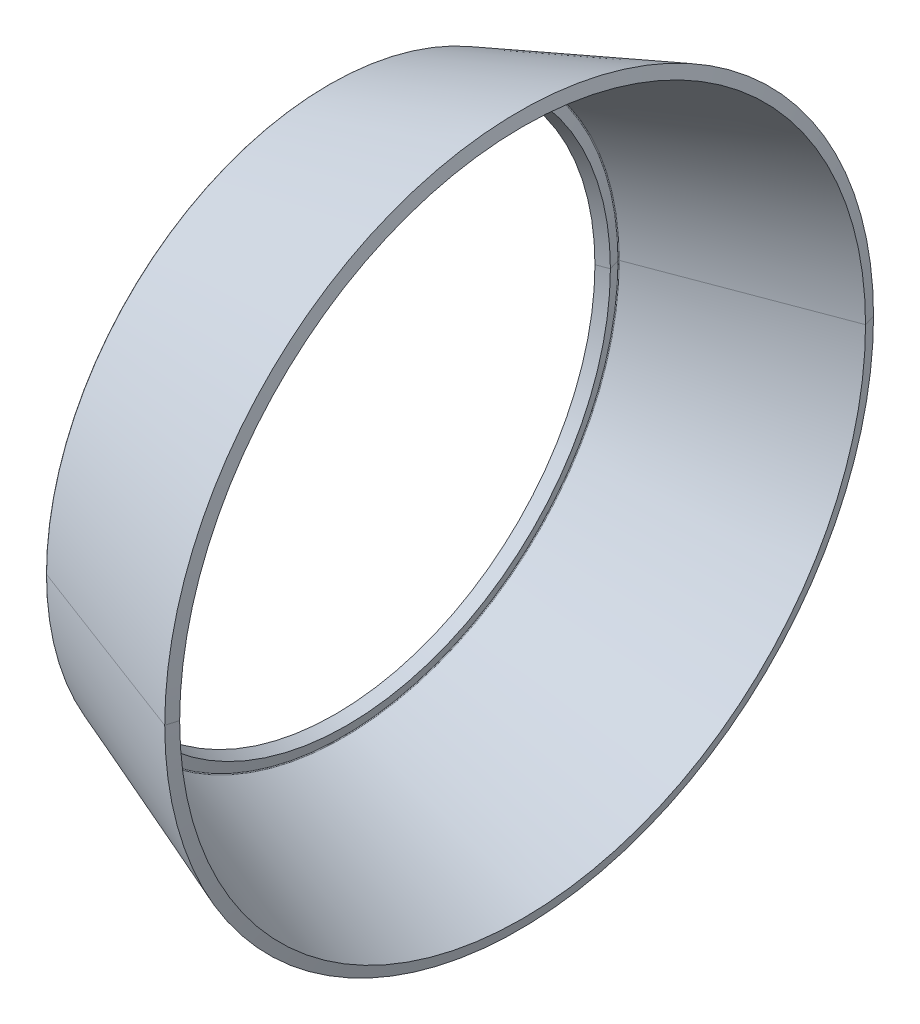
ISO-10303-21;
HEADER;
FILE_DESCRIPTION(('STEP AP214'),'2;1');
FILE_NAME('part.step','',(''),(''),'','','');
FILE_SCHEMA(('AUTOMOTIVE_DESIGN { 1 0 10303 214 1 1 1 1 }'));
ENDSEC;
DATA;
#1=APPLICATION_CONTEXT('core data for automotive mechanical design processes');
#2=APPLICATION_PROTOCOL_DEFINITION('international standard','automotive_design',2000,#1);
#3=PRODUCT_CONTEXT('',#1,'mechanical');
#4=PRODUCT('Part','Part','',(#3));
#5=PRODUCT_RELATED_PRODUCT_CATEGORY('part','',(#4));
#6=PRODUCT_DEFINITION_FORMATION('','',#4);
#7=PRODUCT_DEFINITION_CONTEXT('part definition',#1,'design');
#8=PRODUCT_DEFINITION('design','',#6,#7);
#9=PRODUCT_DEFINITION_SHAPE('','',#8);
#10=(LENGTH_UNIT() NAMED_UNIT(*) SI_UNIT(.MILLI.,.METRE.));
#11=(NAMED_UNIT(*) PLANE_ANGLE_UNIT() SI_UNIT($,.RADIAN.));
#12=(NAMED_UNIT(*) SI_UNIT($,.STERADIAN.) SOLID_ANGLE_UNIT());
#13=UNCERTAINTY_MEASURE_WITH_UNIT(LENGTH_MEASURE(1.E-05),#10,'distance_accuracy_value','');
#14=(GEOMETRIC_REPRESENTATION_CONTEXT(3) GLOBAL_UNCERTAINTY_ASSIGNED_CONTEXT((#13)) GLOBAL_UNIT_ASSIGNED_CONTEXT((#10,
#11,#12)) REPRESENTATION_CONTEXT('',''));
#15=CARTESIAN_POINT('',(0.,0.,0.));
#16=DIRECTION('',(0.,0.,1.));
#17=DIRECTION('',(1.,0.,0.));
#18=AXIS2_PLACEMENT_3D('',#15,#16,#17);
#19=CARTESIAN_POINT('',(14.857621984077,0.,0.));
#20=DIRECTION('',(1.,0.,0.));
#21=DIRECTION('',(0.,1.,0.));
#22=AXIS2_PLACEMENT_3D('',#19,#20,#21);
#23=CONICAL_SURFACE('',#22,29.6324119771,0.3606897432);
#24=CARTESIAN_POINT('',(-0.996642846062906,0.,0.));
#25=DIRECTION('',(1.,0.,0.));
#26=DIRECTION('',(0.,0.,-1.));
#27=AXIS2_PLACEMENT_3D('',#24,#25,#26);
#28=CIRCLE('',#27,23.6523335549);
#29=CARTESIAN_POINT('',(-0.996642846172319,0.,23.6523335551901));
#30=VERTEX_POINT('',#29);
#31=CARTESIAN_POINT('',(-0.996642846062906,0.,-23.652333554949));
#32=VERTEX_POINT('',#31);
#33=EDGE_CURVE('E13',#30,#32,#28,.T.);
#34=ORIENTED_EDGE('',*,*,#33,.T.);
#35=DIRECTION('',(0.935653622315837,0.,-0.352919677897469));
#36=VECTOR('',#35,1.);
#37=CARTESIAN_POINT('',(-0.996642846172319,0.,-23.6523335551901));
#38=LINE('',#37,#36);
#39=CARTESIAN_POINT('',(14.857621984077,0.,-29.632411977128));
#40=VERTEX_POINT('',#39);
#41=EDGE_CURVE('E35',#32,#40,#38,.T.);
#42=ORIENTED_EDGE('',*,*,#41,.T.);
#43=CARTESIAN_POINT('',(14.857621984077,0.,0.));
#44=DIRECTION('',(1.,0.,0.));
#45=DIRECTION('',(0.,0.,-1.));
#46=AXIS2_PLACEMENT_3D('',#43,#44,#45);
#47=CIRCLE('',#46,29.6324119771);
#48=CARTESIAN_POINT('',(14.857621984077,0.,29.6324119771));
#49=VERTEX_POINT('',#48);
#50=EDGE_CURVE('E116',#49,#40,#47,.T.);
#51=ORIENTED_EDGE('',*,*,#50,.F.);
#52=DIRECTION('',(0.935653622315837,0.,0.352919677897469));
#53=VECTOR('',#52,1.);
#54=CARTESIAN_POINT('',(-0.996642846172319,0.,23.6523335551901));
#55=LINE('',#54,#53);
#56=EDGE_CURVE('E323',#30,#49,#55,.T.);
#57=ORIENTED_EDGE('',*,*,#56,.F.);
#58=EDGE_LOOP('',(#34,#42,#51,#57));
#59=FACE_BOUND('',#58,.T.);
#60=ADVANCED_FACE('F27',(#59),#23,.T.);
#61=CARTESIAN_POINT('',(14.857621984077,0.,0.));
#62=DIRECTION('',(1.,0.,0.));
#63=DIRECTION('',(0.,-1.,0.));
#64=AXIS2_PLACEMENT_3D('',#61,#62,#63);
#65=CONICAL_SURFACE('',#64,29.6324119771,0.3606897432);
#66=CARTESIAN_POINT('',(14.857621984077,0.,0.));
#67=DIRECTION('',(1.,0.,0.));
#68=DIRECTION('',(0.,0.,-1.));
#69=AXIS2_PLACEMENT_3D('',#66,#67,#68);
#70=CIRCLE('',#69,29.6324119771);
#71=EDGE_CURVE('E319',#40,#49,#70,.T.);
#72=ORIENTED_EDGE('',*,*,#71,.F.);
#73=ORIENTED_EDGE('',*,*,#41,.F.);
#74=CARTESIAN_POINT('',(-0.996642846062906,0.,0.));
#75=DIRECTION('',(1.,0.,0.));
#76=DIRECTION('',(0.,0.,-1.));
#77=AXIS2_PLACEMENT_3D('',#74,#75,#76);
#78=CIRCLE('',#77,23.6523335549);
#79=EDGE_CURVE('E316',#32,#30,#78,.T.);
#80=ORIENTED_EDGE('',*,*,#79,.T.);
#81=ORIENTED_EDGE('',*,*,#56,.T.);
#82=EDGE_LOOP('',(#72,#73,#80,#81));
#83=FACE_BOUND('',#82,.T.);
#84=ADVANCED_FACE('F336',(#83),#65,.T.);
#85=CARTESIAN_POINT('',(-0.961350878272621,0.,0.));
#86=DIRECTION('',(1.,0.,0.));
#87=DIRECTION('',(0.,-1.,0.));
#88=AXIS2_PLACEMENT_3D('',#85,#86,#87);
#89=TOROIDAL_SURFACE('',#88,23.5587681927,0.1);
#90=ORIENTED_EDGE('',*,*,#79,.F.);
#91=CARTESIAN_POINT('',(-1.05706616512341,0.,-23.5298098801962));
#92=CARTESIAN_POINT('',(-1.05751984284234,0.,-23.5313093106755));
#93=CARTESIAN_POINT('',(-1.05793823064323,0.,-23.5328194155091));
#94=CARTESIAN_POINT('',(-1.05870362680218,0.,-23.5358576078113));
#95=CARTESIAN_POINT('',(-1.05905063516023,0.,-23.5373856952798));
#96=CARTESIAN_POINT('',(-1.05967247282678,0.,-23.5404564867783));
#97=CARTESIAN_POINT('',(-1.05994730213527,0.,-23.5419991908083));
#98=CARTESIAN_POINT('',(-1.06042418372442,0.,-23.5450958064376));
#99=CARTESIAN_POINT('',(-1.06062623600508,0.,-23.546649718037));
#100=CARTESIAN_POINT('',(-1.06095711495626,0.,-23.5497653179149));
#101=CARTESIAN_POINT('',(-1.06108594162678,0.,-23.5513270061935));
#102=CARTESIAN_POINT('',(-1.06127008551142,0.,-23.5544547106024));
#103=CARTESIAN_POINT('',(-1.06132540272553,0.,-23.5560207267327));
#104=CARTESIAN_POINT('',(-1.06136240536899,0.,-23.559153628665));
#105=CARTESIAN_POINT('',(-1.06134409079834,0.,-23.5607205144671));
#106=CARTESIAN_POINT('',(-1.06123387036223,0.,-23.5638516955878));
#107=CARTESIAN_POINT('',(-1.06114196449677,0.,-23.5654159909064));
#108=CARTESIAN_POINT('',(-1.06088476441384,0.,-23.5685385366401));
#109=CARTESIAN_POINT('',(-1.06071947019637,0.,-23.5700967870553));
#110=CARTESIAN_POINT('',(-1.06031585843087,0.,-23.573203801907));
#111=CARTESIAN_POINT('',(-1.06007754088283,0.,-23.5747525663436));
#112=CARTESIAN_POINT('',(-1.05952840873038,0.,-23.577837189112));
#113=CARTESIAN_POINT('',(-1.05921759412597,0.,-23.5793730474439));
#114=CARTESIAN_POINT('',(-1.05852415423088,0.,-23.5824284663771));
#115=CARTESIAN_POINT('',(-1.05814152894019,0.,-23.5839480269783));
#116=CARTESIAN_POINT('',(-1.05730531262142,0.,-23.5869674948144));
#117=CARTESIAN_POINT('',(-1.05685172159332,0.,-23.5884674020493));
#118=CARTESIAN_POINT('',(-1.05587457546184,0.,-23.5914442509172));
#119=CARTESIAN_POINT('',(-1.05535102035846,0.,-23.5929211925504));
#120=CARTESIAN_POINT('',(-1.0542351022397,0.,-23.5958488486943));
#121=CARTESIAN_POINT('',(-1.05364273922434,0.,-23.5972995632052));
#122=CARTESIAN_POINT('',(-1.05239051339299,0.,-23.6001715615012));
#123=CARTESIAN_POINT('',(-1.05173065057702,0.,-23.6015928452864));
#124=CARTESIAN_POINT('',(-1.0503448823152,0.,-23.6044028435194));
#125=CARTESIAN_POINT('',(-1.04961897686936,0.,-23.6057915579672));
#126=CARTESIAN_POINT('',(-1.04810272636006,0.,-23.6085333508365));
#127=CARTESIAN_POINT('',(-1.0473123812966,0.,-23.609886429258));
#128=CARTESIAN_POINT('',(-1.04566899686591,0.,-23.6125539620802));
#129=CARTESIAN_POINT('',(-1.04481595749868,0.,-23.6138684164811));
#130=CARTESIAN_POINT('',(-1.04304906822169,0.,-23.6164557985611));
#131=CARTESIAN_POINT('',(-1.04213521831194,0.,-23.6177287262402));
#132=CARTESIAN_POINT('',(-1.04024872599869,0.,-23.620230243879));
#133=CARTESIAN_POINT('',(-1.0392760835952,0.,-23.6214588338386));
#134=CARTESIAN_POINT('',(-1.03727415417435,0.,-23.6238689629511));
#135=CARTESIAN_POINT('',(-1.03624486715699,0.,-23.6250505021041));
#136=CARTESIAN_POINT('',(-1.03413192147613,0.,-23.6273639204178));
#137=CARTESIAN_POINT('',(-1.03304826281261,0.,-23.6284957995786));
#138=CARTESIAN_POINT('',(-1.03082896687613,0.,-23.6307073983877));
#139=CARTESIAN_POINT('',(-1.02969332960315,0.,-23.6317871180359));
#140=CARTESIAN_POINT('',(-1.02737258426677,0.,-23.6338920134788));
#141=CARTESIAN_POINT('',(-1.02618747620336,0.,-23.6349171892735));
#142=CARTESIAN_POINT('',(-1.02377040635751,0.,-23.6369107331319));
#143=CARTESIAN_POINT('',(-1.02253844457509,0.,-23.6378791011957));
#144=CARTESIAN_POINT('',(-1.02003038780556,0.,-23.6397568911079));
#145=CARTESIAN_POINT('',(-1.01875429281846,0.,-23.6406663129563));
#146=CARTESIAN_POINT('',(-1.01616078770201,0.,-23.6424242023301));
#147=CARTESIAN_POINT('',(-1.01484337757266,-1.01458583407308E-13,-23.6432726698554));
#148=CARTESIAN_POINT('',(-1.01217015113787,-1.01479689002968E-13,-23.644906776311));
#149=CARTESIAN_POINT('',(-1.01081433483243,0.,-23.6456924152413));
#150=CARTESIAN_POINT('',(-1.00806729106361,0.,-23.6471991318497));
#151=CARTESIAN_POINT('',(-1.00667606360022,0.,-23.6479202095277));
#152=CARTESIAN_POINT('',(-1.00386126610459,0.,-23.6492962028306));
#153=CARTESIAN_POINT('',(-1.00243769607235,0.,-23.6499511184553));
#154=CARTESIAN_POINT('',(-0.999561370719238,0.,-23.6511933729414));
#155=CARTESIAN_POINT('',(-0.99810861539836,0.,-23.6517807118028));
#156=CARTESIAN_POINT('',(-0.996642846073272,0.,-23.6523335549275));
#157=B_SPLINE_CURVE_WITH_KNOTS('',3,(#91,#92,#93,#94,#95,#96,#97,#98,#99,#100,#101,#102,#103,
#104,#105,#106,#107,#108,#109,#110,#111,#112,#113,#114,#115,#116,#117,#118,#119,#120,#121,#122,
#123,#124,#125,#126,#127,#128,#129,#130,#131,#132,#133,#134,#135,#136,#137,#138,#139,#140,#141,
#142,#143,#144,#145,#146,#147,#148,#149,#150,#151,#152,#153,#154,#155,#156),.UNSPECIFIED.,.F.,
.F.,(4,2,2,2,2,2,2,2,2,2,2,2,2,2,2,2,2,2,2,2,2,2,2,2,2,2,2,2,2,2,2,2,4),(0.,0.00469924830444448,
0.00939849660889152,0.0140977449133345,0.0187969932177795,0.0234962415222242,0.0281954898266712,
0.0328947381311154,0.0375939864355601,0.0422932347400067,0.0469924830444515,0.0516917313488946,
0.0563909796533411,0.0610902279577838,0.0657894762622316,0.0704887245666752,0.0751879728711216,
0.0798872211755658,0.0845864694800113,0.0892857177844545,0.0939849660889005,0.0986842143933442,
0.10338346269779,0.108082711002236,0.112781959306679,0.117481207611125,0.12218045591557,
0.126879704220015,0.131578952524459,0.136278200828904,0.14097744913335,0.145676697437795,
0.150375945742239),.UNSPECIFIED.);
#158=CARTESIAN_POINT('',(-1.0570661651107,0.,-23.529809880176));
#159=VERTEX_POINT('',#158);
#160=EDGE_CURVE('E286',#159,#32,#157,.T.);
#161=ORIENTED_EDGE('',*,*,#160,.F.);
#162=CARTESIAN_POINT('',(-1.0570661651107,0.,0.));
#163=DIRECTION('',(1.,0.,0.));
#164=DIRECTION('',(0.,0.,-1.));
#165=AXIS2_PLACEMENT_3D('',#162,#163,#164);
#166=CIRCLE('',#165,23.5298098802);
#167=CARTESIAN_POINT('',(-1.05706616512338,0.,23.5298098801962));
#168=VERTEX_POINT('',#167);
#169=EDGE_CURVE('E303',#159,#168,#166,.T.);
#170=ORIENTED_EDGE('',*,*,#169,.T.);
#171=CARTESIAN_POINT('',(-1.05706616512341,0.,23.5298098801962));
#172=CARTESIAN_POINT('',(-1.05751984284234,0.,23.5313093106755));
#173=CARTESIAN_POINT('',(-1.05793823064323,0.,23.5328194155091));
#174=CARTESIAN_POINT('',(-1.05870362680218,0.,23.5358576078113));
#175=CARTESIAN_POINT('',(-1.05905063516023,0.,23.5373856952798));
#176=CARTESIAN_POINT('',(-1.05967247282678,0.,23.5404564867783));
#177=CARTESIAN_POINT('',(-1.05994730213527,0.,23.5419991908083));
#178=CARTESIAN_POINT('',(-1.06042418372442,0.,23.5450958064376));
#179=CARTESIAN_POINT('',(-1.06062623600508,0.,23.546649718037));
#180=CARTESIAN_POINT('',(-1.06095711495626,0.,23.5497653179149));
#181=CARTESIAN_POINT('',(-1.06108594162678,0.,23.5513270061935));
#182=CARTESIAN_POINT('',(-1.06127008551142,0.,23.5544547106024));
#183=CARTESIAN_POINT('',(-1.06132540272553,0.,23.5560207267327));
#184=CARTESIAN_POINT('',(-1.06136240536899,0.,23.559153628665));
#185=CARTESIAN_POINT('',(-1.06134409079834,0.,23.5607205144671));
#186=CARTESIAN_POINT('',(-1.06123387036223,0.,23.5638516955878));
#187=CARTESIAN_POINT('',(-1.06114196449677,0.,23.5654159909064));
#188=CARTESIAN_POINT('',(-1.06088476441384,0.,23.5685385366401));
#189=CARTESIAN_POINT('',(-1.06071947019637,0.,23.5700967870553));
#190=CARTESIAN_POINT('',(-1.06031585843087,0.,23.573203801907));
#191=CARTESIAN_POINT('',(-1.06007754088283,0.,23.5747525663436));
#192=CARTESIAN_POINT('',(-1.05952840873038,0.,23.577837189112));
#193=CARTESIAN_POINT('',(-1.05921759412597,0.,23.5793730474439));
#194=CARTESIAN_POINT('',(-1.05852415423088,0.,23.5824284663771));
#195=CARTESIAN_POINT('',(-1.05814152894019,0.,23.5839480269783));
#196=CARTESIAN_POINT('',(-1.05730531262142,0.,23.5869674948144));
#197=CARTESIAN_POINT('',(-1.05685172159332,0.,23.5884674020493));
#198=CARTESIAN_POINT('',(-1.05587457546184,0.,23.5914442509172));
#199=CARTESIAN_POINT('',(-1.05535102035846,0.,23.5929211925504));
#200=CARTESIAN_POINT('',(-1.0542351022397,0.,23.5958488486943));
#201=CARTESIAN_POINT('',(-1.05364273922434,0.,23.5972995632052));
#202=CARTESIAN_POINT('',(-1.05239051339299,0.,23.6001715615012));
#203=CARTESIAN_POINT('',(-1.05173065057702,0.,23.6015928452864));
#204=CARTESIAN_POINT('',(-1.0503448823152,0.,23.6044028435194));
#205=CARTESIAN_POINT('',(-1.04961897686936,0.,23.6057915579672));
#206=CARTESIAN_POINT('',(-1.04810272636006,0.,23.6085333508365));
#207=CARTESIAN_POINT('',(-1.0473123812966,0.,23.609886429258));
#208=CARTESIAN_POINT('',(-1.04566899686591,0.,23.6125539620802));
#209=CARTESIAN_POINT('',(-1.04481595749868,0.,23.6138684164811));
#210=CARTESIAN_POINT('',(-1.04304906822169,0.,23.6164557985611));
#211=CARTESIAN_POINT('',(-1.04213521831194,0.,23.6177287262402));
#212=CARTESIAN_POINT('',(-1.04024872599869,0.,23.620230243879));
#213=CARTESIAN_POINT('',(-1.0392760835952,0.,23.6214588338386));
#214=CARTESIAN_POINT('',(-1.03727415417435,0.,23.6238689629511));
#215=CARTESIAN_POINT('',(-1.03624486715699,0.,23.6250505021041));
#216=CARTESIAN_POINT('',(-1.03413192147613,0.,23.6273639204178));
#217=CARTESIAN_POINT('',(-1.03304826281261,0.,23.6284957995786));
#218=CARTESIAN_POINT('',(-1.03082896687613,0.,23.6307073983877));
#219=CARTESIAN_POINT('',(-1.02969332960315,0.,23.6317871180359));
#220=CARTESIAN_POINT('',(-1.02737258426677,0.,23.6338920134788));
#221=CARTESIAN_POINT('',(-1.02618747620335,0.,23.6349171892735));
#222=CARTESIAN_POINT('',(-1.02377040635751,0.,23.6369107331319));
#223=CARTESIAN_POINT('',(-1.02253844457509,0.,23.6378791011957));
#224=CARTESIAN_POINT('',(-1.02003038780556,0.,23.6397568911079));
#225=CARTESIAN_POINT('',(-1.01875429281846,0.,23.6406663129563));
#226=CARTESIAN_POINT('',(-1.01616078770201,0.,23.6424242023301));
#227=CARTESIAN_POINT('',(-1.01484337757266,0.,23.6432726698554));
#228=CARTESIAN_POINT('',(-1.01217015113787,0.,23.644906776311));
#229=CARTESIAN_POINT('',(-1.01081433483243,0.,23.6456924152413));
#230=CARTESIAN_POINT('',(-1.0080672910636,0.,23.6471991318497));
#231=CARTESIAN_POINT('',(-1.00667606360022,0.,23.6479202095277));
#232=CARTESIAN_POINT('',(-1.00386126610459,0.,23.6492962028306));
#233=CARTESIAN_POINT('',(-1.00243769607235,0.,23.6499511184553));
#234=CARTESIAN_POINT('',(-0.999561370719237,0.,23.6511933729414));
#235=CARTESIAN_POINT('',(-0.99810861539836,0.,23.6517807118028));
#236=CARTESIAN_POINT('',(-0.996642846073272,0.,23.6523335549275));
#237=B_SPLINE_CURVE_WITH_KNOTS('',3,(#171,#172,#173,#174,#175,#176,#177,#178,#179,#180,#181,
#182,#183,#184,#185,#186,#187,#188,#189,#190,#191,#192,#193,#194,#195,#196,#197,#198,#199,#200,
#201,#202,#203,#204,#205,#206,#207,#208,#209,#210,#211,#212,#213,#214,#215,#216,#217,#218,#219,
#220,#221,#222,#223,#224,#225,#226,#227,#228,#229,#230,#231,#232,#233,#234,#235,#236),
.UNSPECIFIED.,.F.,.F.,(4,2,2,2,2,2,2,2,2,2,2,2,2,2,2,2,2,2,2,2,2,2,2,2,2,2,2,2,2,2,2,2,4),(0.,
0.00469924830444448,0.00939849660889157,0.0140977449133345,0.0187969932177795,
0.0234962415222242,0.0281954898266712,0.0328947381311154,0.0375939864355601,0.0422932347400067,
0.0469924830444515,0.0516917313488946,0.0563909796533411,0.0610902279577838,0.0657894762622316,
0.0704887245666752,0.0751879728711216,0.0798872211755657,0.0845864694800113,0.0892857177844545,
0.0939849660889005,0.0986842143933442,0.10338346269779,0.108082711002236,0.112781959306679,
0.117481207611125,0.122180455915571,0.126879704220015,0.131578952524461,0.136278200828904,
0.14097744913335,0.145676697437795,0.15037594574224),.UNSPECIFIED.);
#238=EDGE_CURVE('E288',#168,#30,#237,.T.);
#239=ORIENTED_EDGE('',*,*,#238,.T.);
#240=EDGE_LOOP('',(#90,#161,#170,#239));
#241=FACE_BOUND('',#240,.T.);
#242=ADVANCED_FACE('F270',(#241),#89,.T.);
#243=CARTESIAN_POINT('',(-0.961350878272621,0.,0.));
#244=DIRECTION('',(1.,0.,0.));
#245=DIRECTION('',(0.,1.,0.));
#246=AXIS2_PLACEMENT_3D('',#243,#244,#245);
#247=TOROIDAL_SURFACE('',#246,23.5587681927,0.1);
#248=CARTESIAN_POINT('',(-1.0570661651107,0.,0.));
#249=DIRECTION('',(1.,0.,0.));
#250=DIRECTION('',(0.,0.,-1.));
#251=AXIS2_PLACEMENT_3D('',#248,#249,#250);
#252=CIRCLE('',#251,23.5298098802);
#253=EDGE_CURVE('E250',#168,#159,#252,.T.);
#254=ORIENTED_EDGE('',*,*,#253,.T.);
#255=ORIENTED_EDGE('',*,*,#160,.T.);
#256=ORIENTED_EDGE('',*,*,#33,.F.);
#257=ORIENTED_EDGE('',*,*,#238,.F.);
#258=EDGE_LOOP('',(#254,#255,#256,#257));
#259=FACE_BOUND('',#258,.T.);
#260=ADVANCED_FACE('F259',(#259),#247,.T.);
#261=CARTESIAN_POINT('',(-1.0570661651107,0.,0.));
#262=DIRECTION('',(-1.,0.,0.));
#263=DIRECTION('',(0.,1.,0.));
#264=AXIS2_PLACEMENT_3D('',#261,#262,#263);
#265=CONICAL_SURFACE('',#264,23.5298098802,1.2770050538);
#266=ORIENTED_EDGE('',*,*,#253,.F.);
#267=DIRECTION('',(-0.28958312542881,0.,0.957152868389832));
#268=VECTOR('',#267,1.);
#269=CARTESIAN_POINT('',(-0.503684562952605,0.,21.7007295875018));
#270=LINE('',#269,#268);
#271=CARTESIAN_POINT('',(-0.503684562952605,0.,21.7007295875018));
#272=VERTEX_POINT('',#271);
#273=EDGE_CURVE('E245',#272,#168,#270,.T.);
#274=ORIENTED_EDGE('',*,*,#273,.F.);
#275=CARTESIAN_POINT('',(-0.50368456295849,0.,0.));
#276=DIRECTION('',(1.,0.,0.));
#277=DIRECTION('',(0.,0.,-1.));
#278=AXIS2_PLACEMENT_3D('',#275,#276,#277);
#279=CIRCLE('',#278,21.7007295875);
#280=CARTESIAN_POINT('',(-0.50368456295849,0.,-21.700729587453));
#281=VERTEX_POINT('',#280);
#282=EDGE_CURVE('E241',#272,#281,#279,.T.);
#283=ORIENTED_EDGE('',*,*,#282,.T.);
#284=DIRECTION('',(-0.28958312542881,0.,-0.957152868389832));
#285=VECTOR('',#284,1.);
#286=CARTESIAN_POINT('',(-0.503684562952605,0.,-21.7007295875018));
#287=LINE('',#286,#285);
#288=EDGE_CURVE('E236',#281,#159,#287,.T.);
#289=ORIENTED_EDGE('',*,*,#288,.T.);
#290=EDGE_LOOP('',(#266,#274,#283,#289));
#291=FACE_BOUND('',#290,.T.);
#292=ADVANCED_FACE('F269',(#291),#265,.F.);
#293=CARTESIAN_POINT('',(-1.0570661651107,0.,0.));
#294=DIRECTION('',(-1.,0.,0.));
#295=DIRECTION('',(0.,-1.,0.));
#296=AXIS2_PLACEMENT_3D('',#293,#294,#295);
#297=CONICAL_SURFACE('',#296,23.5298098802,1.2770050538);
#298=CARTESIAN_POINT('',(-0.50368456295849,0.,0.));
#299=DIRECTION('',(1.,0.,0.));
#300=DIRECTION('',(0.,0.,-1.));
#301=AXIS2_PLACEMENT_3D('',#298,#299,#300);
#302=CIRCLE('',#301,21.7007295875);
#303=EDGE_CURVE('E231',#281,#272,#302,.T.);
#304=ORIENTED_EDGE('',*,*,#303,.T.);
#305=ORIENTED_EDGE('',*,*,#273,.T.);
#306=ORIENTED_EDGE('',*,*,#169,.F.);
#307=ORIENTED_EDGE('',*,*,#288,.F.);
#308=EDGE_LOOP('',(#304,#305,#306,#307));
#309=FACE_BOUND('',#308,.T.);
#310=ADVANCED_FACE('F359',(#309),#297,.F.);
#311=CARTESIAN_POINT('',(-0.50368456295849,0.,0.));
#312=DIRECTION('',(1.,0.,0.));
#313=DIRECTION('',(0.,-1.,0.));
#314=AXIS2_PLACEMENT_3D('',#311,#312,#313);
#315=CONICAL_SURFACE('',#314,21.7007295875,0.3606897432);
#316=CARTESIAN_POINT('',(0.434066685327916,0.,0.));
#317=DIRECTION('',(1.,0.,0.));
#318=DIRECTION('',(0.,0.,-1.));
#319=AXIS2_PLACEMENT_3D('',#316,#317,#318);
#320=CIRCLE('',#319,22.05444047);
#321=CARTESIAN_POINT('',(0.434066685327916,0.,-22.054440470003));
#322=VERTEX_POINT('',#321);
#323=CARTESIAN_POINT('',(0.434066685317508,0.,22.0544404700276));
#324=VERTEX_POINT('',#323);
#325=EDGE_CURVE('E227',#322,#324,#320,.T.);
#326=ORIENTED_EDGE('',*,*,#325,.T.);
#327=DIRECTION('',(0.935653622315838,0.,0.352919677897465));
#328=VECTOR('',#327,1.);
#329=CARTESIAN_POINT('',(-0.50368456295849,0.,21.7007295875));
#330=LINE('',#329,#328);
#331=EDGE_CURVE('E222',#272,#324,#330,.T.);
#332=ORIENTED_EDGE('',*,*,#331,.F.);
#333=ORIENTED_EDGE('',*,*,#303,.F.);
#334=DIRECTION('',(0.935653622315838,0.,-0.352919677897465));
#335=VECTOR('',#334,1.);
#336=CARTESIAN_POINT('',(-0.50368456295849,0.,-21.7007295875));
#337=LINE('',#336,#335);
#338=EDGE_CURVE('E218',#281,#322,#337,.T.);
#339=ORIENTED_EDGE('',*,*,#338,.T.);
#340=EDGE_LOOP('',(#326,#332,#333,#339));
#341=FACE_BOUND('',#340,.T.);
#342=ADVANCED_FACE('F366',(#341),#315,.F.);
#343=CARTESIAN_POINT('',(-0.50368456295849,0.,0.));
#344=DIRECTION('',(1.,0.,0.));
#345=DIRECTION('',(0.,1.,0.));
#346=AXIS2_PLACEMENT_3D('',#343,#344,#345);
#347=CONICAL_SURFACE('',#346,21.7007295875,0.3606897432);
#348=ORIENTED_EDGE('',*,*,#282,.F.);
#349=ORIENTED_EDGE('',*,*,#331,.T.);
#350=CARTESIAN_POINT('',(0.434066685327916,0.,0.));
#351=DIRECTION('',(1.,0.,0.));
#352=DIRECTION('',(0.,0.,-1.));
#353=AXIS2_PLACEMENT_3D('',#350,#351,#352);
#354=CIRCLE('',#353,22.05444047);
#355=EDGE_CURVE('E213',#324,#322,#354,.T.);
#356=ORIENTED_EDGE('',*,*,#355,.T.);
#357=ORIENTED_EDGE('',*,*,#338,.F.);
#358=EDGE_LOOP('',(#348,#349,#356,#357));
#359=FACE_BOUND('',#358,.T.);
#360=ADVANCED_FACE('F373',(#359),#347,.F.);
#361=CARTESIAN_POINT('',(0.434066685327916,0.,0.));
#362=DIRECTION('',(-1.,0.,0.));
#363=DIRECTION('',(0.,1.,0.));
#364=AXIS2_PLACEMENT_3D('',#361,#362,#363);
#365=CONICAL_SURFACE('',#364,22.05444047,1.2770050538);
#366=CARTESIAN_POINT('',(0.161889729531989,0.,0.));
#367=DIRECTION('',(1.,0.,0.));
#368=DIRECTION('',(0.,0.,-1.));
#369=AXIS2_PLACEMENT_3D('',#366,#367,#368);
#370=CIRCLE('',#369,22.9540611008);
#371=CARTESIAN_POINT('',(0.161889729515113,0.,22.9540611007949));
#372=VERTEX_POINT('',#371);
#373=CARTESIAN_POINT('',(0.161889729531989,0.,-22.954061100764));
#374=VERTEX_POINT('',#373);
#375=EDGE_CURVE('E209',#372,#374,#370,.T.);
#376=ORIENTED_EDGE('',*,*,#375,.T.);
#377=DIRECTION('',(-0.289583125428808,0.,-0.957152868389832));
#378=VECTOR('',#377,1.);
#379=CARTESIAN_POINT('',(0.434066685327916,0.,-22.05444047));
#380=LINE('',#379,#378);
#381=EDGE_CURVE('E204',#322,#374,#380,.T.);
#382=ORIENTED_EDGE('',*,*,#381,.F.);
#383=ORIENTED_EDGE('',*,*,#355,.F.);
#384=DIRECTION('',(-0.289583125428808,0.,0.957152868389832));
#385=VECTOR('',#384,1.);
#386=CARTESIAN_POINT('',(0.434066685327916,0.,22.05444047));
#387=LINE('',#386,#385);
#388=EDGE_CURVE('E200',#324,#372,#387,.T.);
#389=ORIENTED_EDGE('',*,*,#388,.T.);
#390=EDGE_LOOP('',(#376,#382,#383,#389));
#391=FACE_BOUND('',#390,.T.);
#392=ADVANCED_FACE('F381',(#391),#365,.T.);
#393=CARTESIAN_POINT('',(0.434066685327916,0.,0.));
#394=DIRECTION('',(-1.,0.,0.));
#395=DIRECTION('',(0.,-1.,0.));
#396=AXIS2_PLACEMENT_3D('',#393,#394,#395);
#397=CONICAL_SURFACE('',#396,22.05444047,1.2770050538);
#398=ORIENTED_EDGE('',*,*,#325,.F.);
#399=ORIENTED_EDGE('',*,*,#381,.T.);
#400=CARTESIAN_POINT('',(0.161889729531989,0.,0.));
#401=DIRECTION('',(1.,0.,0.));
#402=DIRECTION('',(0.,0.,-1.));
#403=AXIS2_PLACEMENT_3D('',#400,#401,#402);
#404=CIRCLE('',#403,22.9540611008);
#405=EDGE_CURVE('E195',#374,#372,#404,.T.);
#406=ORIENTED_EDGE('',*,*,#405,.T.);
#407=ORIENTED_EDGE('',*,*,#388,.F.);
#408=EDGE_LOOP('',(#398,#399,#406,#407));
#409=FACE_BOUND('',#408,.T.);
#410=ADVANCED_FACE('F389',(#409),#397,.T.);
#411=CARTESIAN_POINT('',(0.22569992075902,0.,0.));
#412=DIRECTION('',(1.,0.,0.));
#413=DIRECTION('',(0.,-1.,0.));
#414=AXIS2_PLACEMENT_3D('',#411,#412,#413);
#415=TOROIDAL_SURFACE('',#414,22.9733666425,0.0666666667);
#416=CARTESIAN_POINT('',(0.202171942230545,0.,0.));
#417=DIRECTION('',(1.,0.,0.));
#418=DIRECTION('',(0.,0.,-1.));
#419=AXIS2_PLACEMENT_3D('',#416,#417,#418);
#420=CIRCLE('',#419,23.0357435506);
#421=CARTESIAN_POINT('',(0.202171942230545,0.,-23.035743550613));
#422=VERTEX_POINT('',#421);
#423=CARTESIAN_POINT('',(0.20217194220104,0.,23.0357435506782));
#424=VERTEX_POINT('',#423);
#425=EDGE_CURVE('E105',#422,#424,#420,.T.);
#426=ORIENTED_EDGE('',*,*,#425,.T.);
#427=CARTESIAN_POINT('',(0.161889729502356,0.,22.954061100791));
#428=CARTESIAN_POINT('',(0.161587277689059,0.,22.9550607211111));
#429=CARTESIAN_POINT('',(0.161308352487808,0.,22.9560674576674));
#430=CARTESIAN_POINT('',(0.160798088380559,0.,22.9580929192033));
#431=CARTESIAN_POINT('',(0.160566749474562,0.,22.959111644183));
#432=CARTESIAN_POINT('',(0.160152191028985,0.,22.9611588385165));
#433=CARTESIAN_POINT('',(0.159968971489405,0.,22.9621873078704));
#434=CARTESIAN_POINT('',(0.159651050428835,0.,22.9642517182912));
#435=CARTESIAN_POINT('',(0.159516348907844,0.,22.9652876593581));
#436=CARTESIAN_POINT('',(0.159295762939329,0.,22.9673647259448));
#437=CARTESIAN_POINT('',(0.159209878491805,0.,22.9684058514645));
#438=CARTESIAN_POINT('',(0.159087115901072,0.,22.9704909877384));
#439=CARTESIAN_POINT('',(0.159050237757864,0.,22.9715349984926));
#440=CARTESIAN_POINT('',(0.159025569327996,0.,22.9736235997823));
#441=CARTESIAN_POINT('',(0.159037779041337,0.,22.9746681903177));
#442=CARTESIAN_POINT('',(0.159111259331266,0.,22.9767556443997));
#443=CARTESIAN_POINT('',(0.159172529907854,0.,22.9777985079461));
#444=CARTESIAN_POINT('',(0.159343996629082,0.,22.9798802051034));
#445=CARTESIAN_POINT('',(0.159454192773723,0.,22.9809190387143));
#446=CARTESIAN_POINT('',(0.159723267283426,0.,22.9829903819503));
#447=CARTESIAN_POINT('',(0.15988214564849,0.,22.9840228915754));
#448=CARTESIAN_POINT('',(0.160248233749577,0.,22.986079306756));
#449=CARTESIAN_POINT('',(0.1604554434856,0.,22.9871032123113));
#450=CARTESIAN_POINT('',(0.160917736748541,0.,22.9891401582683));
#451=CARTESIAN_POINT('',(0.161172820275459,0.,22.9901531986699));
#452=CARTESIAN_POINT('',(0.161730297820947,0.,22.9921661772289));
#453=CARTESIAN_POINT('',(0.162032691839517,0.,22.9931661153863));
#454=CARTESIAN_POINT('',(0.162684122593564,0.,22.9951506812998));
#455=CARTESIAN_POINT('',(0.16303315932904,0.,22.996135309056));
#456=CARTESIAN_POINT('',(0.163777104741362,0.,22.9980870798203));
#457=CARTESIAN_POINT('',(0.164172013418207,0.,22.9990542228283));
#458=CARTESIAN_POINT('',(0.165006830639014,0.,23.0009688883606));
#459=CARTESIAN_POINT('',(0.165446739182976,0.,23.0019164108848));
#460=CARTESIAN_POINT('',(0.166370584690855,0.,23.0037897430417));
#461=CARTESIAN_POINT('',(0.166854521654773,0.,23.0047155526744));
#462=CARTESIAN_POINT('',(0.167865355327729,0.,23.0065434145889));
#463=CARTESIAN_POINT('',(0.168392252036768,0.,23.0074454668706));
#464=CARTESIAN_POINT('',(0.169487841657409,0.,23.009223822087));
#465=CARTESIAN_POINT('',(0.17005653456901,0.,23.0101001250217));
#466=CARTESIAN_POINT('',(0.171234460753936,0.,23.0118250464099));
#467=CARTESIAN_POINT('',(0.171843694027261,0.,23.0126736648634));
#468=CARTESIAN_POINT('',(0.173101355569781,0.,23.0143413432908));
#469=CARTESIAN_POINT('',(0.173749783838977,0.,23.0151604032646));
#470=CARTESIAN_POINT('',(0.175084403453314,0.,23.0167671560078));
#471=CARTESIAN_POINT('',(0.175770594798457,0.,23.0175548487771));
#472=CARTESIAN_POINT('',(0.17717922525289,0.,23.0190971276544));
#473=CARTESIAN_POINT('',(0.17790166436218,0.,23.0198517137624));
#474=CARTESIAN_POINT('',(0.179381194987106,0.,23.0213261129698));
#475=CARTESIAN_POINT('',(0.180138286502741,0.,23.0220459260693));
#476=CARTESIAN_POINT('',(0.181685450061011,0.,23.0234491896993));
#477=CARTESIAN_POINT('',(0.182475522103645,0.,23.0241326402298));
#478=CARTESIAN_POINT('',(0.184086902001626,0.,23.02546166947));
#479=CARTESIAN_POINT('',(0.184908209856972,0.,23.0261072481798));
#480=CARTESIAN_POINT('',(0.18658024770415,0.,23.0273591081226));
#481=CARTESIAN_POINT('',(0.187430977695982,0.,23.0279653893555));
#482=CARTESIAN_POINT('',(0.189159981107843,0.,23.0291373156059));
#483=CARTESIAN_POINT('',(0.190038254527874,0.,23.0297029606234));
#484=CARTESIAN_POINT('',(0.19182040548536,0.,23.0307923649283));
#485=CARTESIAN_POINT('',(0.192724283022816,0.,23.0313161242157));
#486=CARTESIAN_POINT('',(0.194555645536389,0.,23.0323206019557));
#487=CARTESIAN_POINT('',(0.195483130512505,0.,23.0328013204083));
#488=CARTESIAN_POINT('',(0.197359662177335,0.,23.0337186492778));
#489=CARTESIAN_POINT('',(0.198308708866049,0.,23.0341552596948));
#490=CARTESIAN_POINT('',(0.200226259102596,0.,23.0349834293532));
#491=CARTESIAN_POINT('',(0.201194762650428,0.,23.0353749885946));
#492=CARTESIAN_POINT('',(0.202171942201078,0.,23.0357435506782));
#493=B_SPLINE_CURVE_WITH_KNOTS('',3,(#427,#428,#429,#430,#431,#432,#433,#434,#435,#436,#437,
#438,#439,#440,#441,#442,#443,#444,#445,#446,#447,#448,#449,#450,#451,#452,#453,#454,#455,#456,
#457,#458,#459,#460,#461,#462,#463,#464,#465,#466,#467,#468,#469,#470,#471,#472,#473,#474,#475,
#476,#477,#478,#479,#480,#481,#482,#483,#484,#485,#486,#487,#488,#489,#490,#491,#492),
.UNSPECIFIED.,.F.,.F.,(4,2,2,2,2,2,2,2,2,2,2,2,2,2,2,2,2,2,2,2,2,2,2,2,2,2,2,2,2,2,2,2,4),(0.,
0.0031328322050978,0.00626566441019513,0.00939849661529138,0.0125313288203881,
0.0156641610254847,0.0187969932305851,0.0219298254356803,0.02506265764078,0.0281954898458749,
0.0313283220509747,0.034461154256072,0.0375939864611676,0.0407268186662661,0.0438596508713643,
0.0469924830764589,0.0501253152815572,0.0532581474866564,0.0563909796917532,0.0595238118968514,
0.0626566441019462,0.0657894763070454,0.0689223085121419,0.0720551407172389,0.075187972922336,
0.0783208051274348,0.0814536373325325,0.0845864695376295,0.0877193017427276,0.0908521339478242,
0.0939849661529223,0.0971177983580188,0.100250630563116),.UNSPECIFIED.);
#494=EDGE_CURVE('E172',#372,#424,#493,.T.);
#495=ORIENTED_EDGE('',*,*,#494,.F.);
#496=ORIENTED_EDGE('',*,*,#405,.F.);
#497=CARTESIAN_POINT('',(0.161889729502356,0.,-22.954061100791));
#498=CARTESIAN_POINT('',(0.161587277689059,0.,-22.9550607211111));
#499=CARTESIAN_POINT('',(0.161308352487808,0.,-22.9560674576674));
#500=CARTESIAN_POINT('',(0.160798088380559,0.,-22.9580929192033));
#501=CARTESIAN_POINT('',(0.160566749474562,0.,-22.959111644183));
#502=CARTESIAN_POINT('',(0.160152191028985,0.,-22.9611588385165));
#503=CARTESIAN_POINT('',(0.159968971489405,0.,-22.9621873078704));
#504=CARTESIAN_POINT('',(0.159651050428835,0.,-22.9642517182912));
#505=CARTESIAN_POINT('',(0.159516348907844,0.,-22.9652876593581));
#506=CARTESIAN_POINT('',(0.159295762939329,0.,-22.9673647259448));
#507=CARTESIAN_POINT('',(0.159209878491805,0.,-22.9684058514645));
#508=CARTESIAN_POINT('',(0.159087115901072,0.,-22.9704909877384));
#509=CARTESIAN_POINT('',(0.159050237757864,0.,-22.9715349984926));
#510=CARTESIAN_POINT('',(0.159025569327996,0.,-22.9736235997823));
#511=CARTESIAN_POINT('',(0.159037779041337,0.,-22.9746681903177));
#512=CARTESIAN_POINT('',(0.159111259331266,0.,-22.9767556443997));
#513=CARTESIAN_POINT('',(0.159172529907854,0.,-22.9777985079461));
#514=CARTESIAN_POINT('',(0.159343996629082,0.,-22.9798802051034));
#515=CARTESIAN_POINT('',(0.159454192773723,0.,-22.9809190387143));
#516=CARTESIAN_POINT('',(0.159723267283426,0.,-22.9829903819503));
#517=CARTESIAN_POINT('',(0.15988214564849,0.,-22.9840228915754));
#518=CARTESIAN_POINT('',(0.160248233749577,0.,-22.986079306756));
#519=CARTESIAN_POINT('',(0.1604554434856,0.,-22.9871032123113));
#520=CARTESIAN_POINT('',(0.160917736748541,0.,-22.9891401582683));
#521=CARTESIAN_POINT('',(0.161172820275459,0.,-22.9901531986699));
#522=CARTESIAN_POINT('',(0.161730297820947,0.,-22.9921661772289));
#523=CARTESIAN_POINT('',(0.162032691839517,0.,-22.9931661153863));
#524=CARTESIAN_POINT('',(0.162684122593564,0.,-22.9951506812998));
#525=CARTESIAN_POINT('',(0.16303315932904,0.,-22.996135309056));
#526=CARTESIAN_POINT('',(0.163777104741362,0.,-22.9980870798203));
#527=CARTESIAN_POINT('',(0.164172013418207,0.,-22.9990542228283));
#528=CARTESIAN_POINT('',(0.165006830639014,0.,-23.0009688883606));
#529=CARTESIAN_POINT('',(0.165446739182976,0.,-23.0019164108848));
#530=CARTESIAN_POINT('',(0.166370584690855,0.,-23.0037897430417));
#531=CARTESIAN_POINT('',(0.166854521654773,0.,-23.0047155526744));
#532=CARTESIAN_POINT('',(0.167865355327729,0.,-23.0065434145889));
#533=CARTESIAN_POINT('',(0.168392252036768,0.,-23.0074454668706));
#534=CARTESIAN_POINT('',(0.169487841657409,0.,-23.009223822087));
#535=CARTESIAN_POINT('',(0.17005653456901,0.,-23.0101001250217));
#536=CARTESIAN_POINT('',(0.171234460753936,0.,-23.0118250464099));
#537=CARTESIAN_POINT('',(0.171843694027261,0.,-23.0126736648634));
#538=CARTESIAN_POINT('',(0.173101355569781,0.,-23.0143413432908));
#539=CARTESIAN_POINT('',(0.173749783838977,0.,-23.0151604032646));
#540=CARTESIAN_POINT('',(0.175084403453314,0.,-23.0167671560078));
#541=CARTESIAN_POINT('',(0.175770594798457,0.,-23.0175548487771));
#542=CARTESIAN_POINT('',(0.17717922525289,0.,-23.0190971276544));
#543=CARTESIAN_POINT('',(0.17790166436218,0.,-23.0198517137624));
#544=CARTESIAN_POINT('',(0.179381194987106,0.,-23.0213261129698));
#545=CARTESIAN_POINT('',(0.180138286502741,0.,-23.0220459260693));
#546=CARTESIAN_POINT('',(0.181685450061011,0.,-23.0234491896993));
#547=CARTESIAN_POINT('',(0.182475522103645,0.,-23.0241326402298));
#548=CARTESIAN_POINT('',(0.184086902001626,0.,-23.02546166947));
#549=CARTESIAN_POINT('',(0.184908209856973,0.,-23.0261072481798));
#550=CARTESIAN_POINT('',(0.18658024770415,0.,-23.0273591081226));
#551=CARTESIAN_POINT('',(0.187430977695982,0.,-23.0279653893555));
#552=CARTESIAN_POINT('',(0.189159981107843,0.,-23.0291373156059));
#553=CARTESIAN_POINT('',(0.190038254527874,0.,-23.0297029606234));
#554=CARTESIAN_POINT('',(0.19182040548536,0.,-23.0307923649283));
#555=CARTESIAN_POINT('',(0.192724283022816,0.,-23.0313161242157));
#556=CARTESIAN_POINT('',(0.194555645536389,0.,-23.0323206019557));
#557=CARTESIAN_POINT('',(0.195483130512505,0.,-23.0328013204083));
#558=CARTESIAN_POINT('',(0.197359662177335,0.,-23.0337186492778));
#559=CARTESIAN_POINT('',(0.198308708866049,0.,-23.0341552596948));
#560=CARTESIAN_POINT('',(0.200226259102596,0.,-23.0349834293532));
#561=CARTESIAN_POINT('',(0.201194762650428,0.,-23.0353749885946));
#562=CARTESIAN_POINT('',(0.202171942201078,0.,-23.0357435506782));
#563=B_SPLINE_CURVE_WITH_KNOTS('',3,(#497,#498,#499,#500,#501,#502,#503,#504,#505,#506,#507,
#508,#509,#510,#511,#512,#513,#514,#515,#516,#517,#518,#519,#520,#521,#522,#523,#524,#525,#526,
#527,#528,#529,#530,#531,#532,#533,#534,#535,#536,#537,#538,#539,#540,#541,#542,#543,#544,#545,
#546,#547,#548,#549,#550,#551,#552,#553,#554,#555,#556,#557,#558,#559,#560,#561,#562),
.UNSPECIFIED.,.F.,.F.,(4,2,2,2,2,2,2,2,2,2,2,2,2,2,2,2,2,2,2,2,2,2,2,2,2,2,2,2,2,2,2,2,4),(0.,
0.00313283220509779,0.00626566441019513,0.00939849661529138,0.0125313288203881,
0.0156641610254846,0.0187969932305851,0.0219298254356803,0.02506265764078,0.0281954898458749,
0.0313283220509747,0.034461154256072,0.0375939864611676,0.0407268186662661,0.0438596508713643,
0.0469924830764589,0.0501253152815572,0.0532581474866564,0.0563909796917532,0.0595238118968514,
0.0626566441019462,0.0657894763070454,0.0689223085121419,0.0720551407172389,0.075187972922336,
0.0783208051274348,0.0814536373325325,0.0845864695376295,0.0877193017427276,0.0908521339478243,
0.0939849661529223,0.0971177983580188,0.100250630563116),.UNSPECIFIED.);
#564=EDGE_CURVE('E184',#374,#422,#563,.T.);
#565=ORIENTED_EDGE('',*,*,#564,.T.);
#566=EDGE_LOOP('',(#426,#495,#496,#565));
#567=FACE_BOUND('',#566,.T.);
#568=ADVANCED_FACE('F150',(#567),#415,.F.);
#569=CARTESIAN_POINT('',(0.22569992075902,0.,0.));
#570=DIRECTION('',(1.,0.,0.));
#571=DIRECTION('',(0.,1.,0.));
#572=AXIS2_PLACEMENT_3D('',#569,#570,#571);
#573=TOROIDAL_SURFACE('',#572,22.9733666425,0.0666666667);
#574=ORIENTED_EDGE('',*,*,#375,.F.);
#575=ORIENTED_EDGE('',*,*,#494,.T.);
#576=CARTESIAN_POINT('',(0.202171942230545,0.,0.));
#577=DIRECTION('',(1.,0.,0.));
#578=DIRECTION('',(0.,0.,-1.));
#579=AXIS2_PLACEMENT_3D('',#576,#577,#578);
#580=CIRCLE('',#579,23.0357435506);
#581=EDGE_CURVE('E131',#424,#422,#580,.T.);
#582=ORIENTED_EDGE('',*,*,#581,.T.);
#583=ORIENTED_EDGE('',*,*,#564,.F.);
#584=EDGE_LOOP('',(#574,#575,#582,#583));
#585=FACE_BOUND('',#584,.T.);
#586=ADVANCED_FACE('F140',(#585),#573,.F.);
#587=CARTESIAN_POINT('',(0.202171942230545,0.,0.));
#588=DIRECTION('',(1.,0.,0.));
#589=DIRECTION('',(0.,1.,0.));
#590=AXIS2_PLACEMENT_3D('',#587,#588,#589);
#591=CONICAL_SURFACE('',#590,23.0357435506,0.3606897432);
#592=ORIENTED_EDGE('',*,*,#581,.F.);
#593=DIRECTION('',(0.935653622315837,0.,0.352919677897469));
#594=VECTOR('',#593,1.);
#595=CARTESIAN_POINT('',(0.202171942230545,0.,23.0357435506));
#596=LINE('',#595,#594);
#597=CARTESIAN_POINT('',(15.1478543211055,0.,28.6731132837019));
#598=VERTEX_POINT('',#597);
#599=EDGE_CURVE('E94',#424,#598,#596,.T.);
#600=ORIENTED_EDGE('',*,*,#599,.T.);
#601=CARTESIAN_POINT('',(15.147854320993,0.,0.));
#602=DIRECTION('',(1.,0.,0.));
#603=DIRECTION('',(0.,0.,-1.));
#604=AXIS2_PLACEMENT_3D('',#601,#602,#603);
#605=CIRCLE('',#604,28.673113284);
#606=CARTESIAN_POINT('',(15.147854320993,0.,-28.673113283965));
#607=VERTEX_POINT('',#606);
#608=EDGE_CURVE('E87',#598,#607,#605,.T.);
#609=ORIENTED_EDGE('',*,*,#608,.T.);
#610=DIRECTION('',(0.935653622315837,0.,-0.35291967789747));
#611=VECTOR('',#610,1.);
#612=CARTESIAN_POINT('',(0.202171942230545,0.,-23.0357435506));
#613=LINE('',#612,#611);
#614=EDGE_CURVE('E91',#422,#607,#613,.T.);
#615=ORIENTED_EDGE('',*,*,#614,.F.);
#616=EDGE_LOOP('',(#592,#600,#609,#615));
#617=FACE_BOUND('',#616,.T.);
#618=ADVANCED_FACE('F90',(#617),#591,.F.);
#619=CARTESIAN_POINT('',(0.202171942230545,0.,0.));
#620=DIRECTION('',(1.,0.,0.));
#621=DIRECTION('',(0.,-1.,0.));
#622=AXIS2_PLACEMENT_3D('',#619,#620,#621);
#623=CONICAL_SURFACE('',#622,23.0357435506,0.3606897432);
#624=CARTESIAN_POINT('',(15.147854320993,0.,0.));
#625=DIRECTION('',(1.,0.,0.));
#626=DIRECTION('',(0.,0.,-1.));
#627=AXIS2_PLACEMENT_3D('',#624,#625,#626);
#628=CIRCLE('',#627,28.673113284);
#629=EDGE_CURVE('E103',#607,#598,#628,.T.);
#630=ORIENTED_EDGE('',*,*,#629,.T.);
#631=ORIENTED_EDGE('',*,*,#599,.F.);
#632=ORIENTED_EDGE('',*,*,#425,.F.);
#633=ORIENTED_EDGE('',*,*,#614,.T.);
#634=EDGE_LOOP('',(#630,#631,#632,#633));
#635=FACE_BOUND('',#634,.T.);
#636=ADVANCED_FACE('F102',(#635),#623,.F.);
#637=CARTESIAN_POINT('',(15.147854320993,0.,0.));
#638=DIRECTION('',(-1.,0.,0.));
#639=DIRECTION('',(0.,-1.,0.));
#640=AXIS2_PLACEMENT_3D('',#637,#638,#639);
#641=CONICAL_SURFACE('',#640,28.673113284,1.2770050538);
#642=ORIENTED_EDGE('',*,*,#629,.F.);
#643=DIRECTION('',(-0.289583125428809,0.,-0.957152868389832));
#644=VECTOR('',#643,1.);
#645=CARTESIAN_POINT('',(15.147854320993,0.,-28.673113284));
#646=LINE('',#645,#644);
#647=EDGE_CURVE('E111',#607,#40,#646,.T.);
#648=ORIENTED_EDGE('',*,*,#647,.T.);
#649=ORIENTED_EDGE('',*,*,#71,.T.);
#650=DIRECTION('',(-0.289583125428809,0.,0.957152868389832));
#651=VECTOR('',#650,1.);
#652=CARTESIAN_POINT('',(15.147854320993,0.,28.673113284));
#653=LINE('',#652,#651);
#654=EDGE_CURVE('E113',#598,#49,#653,.T.);
#655=ORIENTED_EDGE('',*,*,#654,.F.);
#656=EDGE_LOOP('',(#642,#648,#649,#655));
#657=FACE_BOUND('',#656,.T.);
#658=ADVANCED_FACE('F109',(#657),#641,.T.);
#659=CARTESIAN_POINT('',(15.147854320993,0.,0.));
#660=DIRECTION('',(-1.,0.,0.));
#661=DIRECTION('',(0.,1.,0.));
#662=AXIS2_PLACEMENT_3D('',#659,#660,#661);
#663=CONICAL_SURFACE('',#662,28.673113284,1.2770050538);
#664=ORIENTED_EDGE('',*,*,#50,.T.);
#665=ORIENTED_EDGE('',*,*,#647,.F.);
#666=ORIENTED_EDGE('',*,*,#608,.F.);
#667=ORIENTED_EDGE('',*,*,#654,.T.);
#668=EDGE_LOOP('',(#664,#665,#666,#667));
#669=FACE_BOUND('',#668,.T.);
#670=ADVANCED_FACE('F115',(#669),#663,.T.);
#671=CLOSED_SHELL('',(#60,#84,#242,#260,#292,#310,#342,#360,#392,#410,#568,#586,#618,#636,#658,#670));
#672=MANIFOLD_SOLID_BREP('B1',#671);
#673=ADVANCED_BREP_SHAPE_REPRESENTATION('',(#18,#672),#14);
#674=SHAPE_DEFINITION_REPRESENTATION(#9,#673);
ENDSEC;
END-ISO-10303-21;
